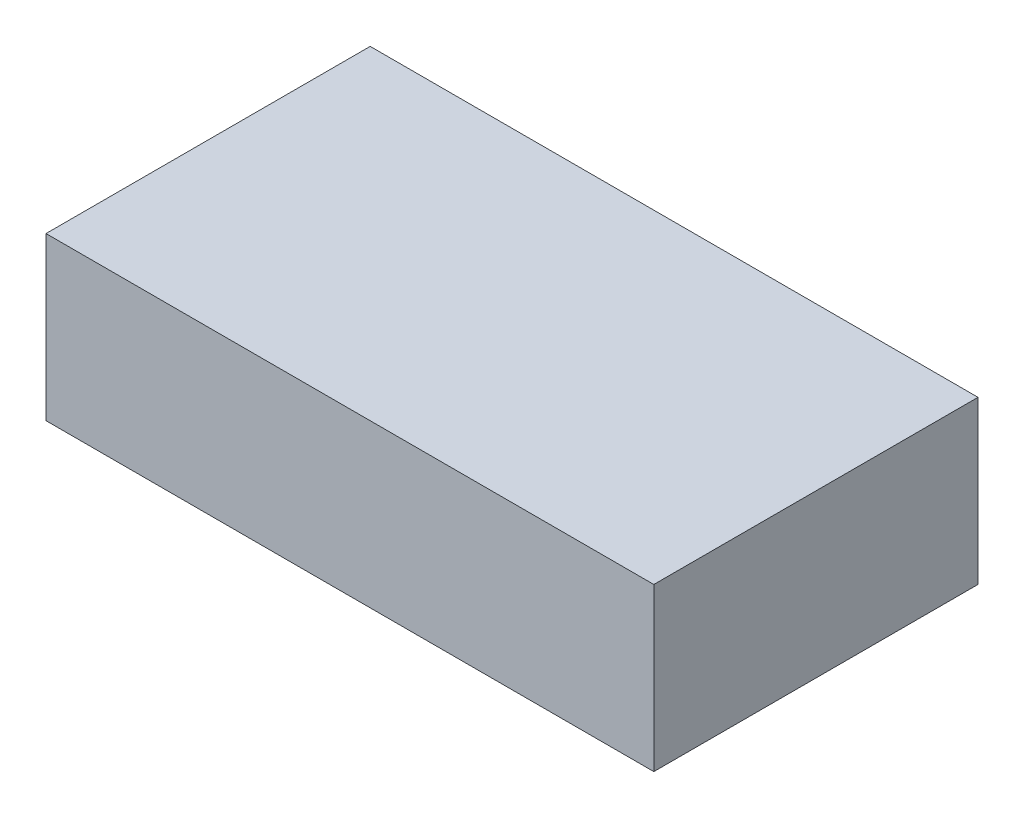
ISO-10303-21;
HEADER;
FILE_DESCRIPTION(('STEP AP214'),'2;1');
FILE_NAME('part.step','',(''),(''),'','','');
FILE_SCHEMA(('AUTOMOTIVE_DESIGN { 1 0 10303 214 1 1 1 1 }'));
ENDSEC;
DATA;
#1=APPLICATION_CONTEXT('core data for automotive mechanical design processes');
#2=APPLICATION_PROTOCOL_DEFINITION('international standard','automotive_design',2000,#1);
#3=PRODUCT_CONTEXT('',#1,'mechanical');
#4=PRODUCT('Part','Part','',(#3));
#5=PRODUCT_RELATED_PRODUCT_CATEGORY('part','',(#4));
#6=PRODUCT_DEFINITION_FORMATION('','',#4);
#7=PRODUCT_DEFINITION_CONTEXT('part definition',#1,'design');
#8=PRODUCT_DEFINITION('design','',#6,#7);
#9=PRODUCT_DEFINITION_SHAPE('','',#8);
#10=(LENGTH_UNIT() NAMED_UNIT(*) SI_UNIT(.MILLI.,.METRE.));
#11=(NAMED_UNIT(*) PLANE_ANGLE_UNIT() SI_UNIT($,.RADIAN.));
#12=(NAMED_UNIT(*) SI_UNIT($,.STERADIAN.) SOLID_ANGLE_UNIT());
#13=UNCERTAINTY_MEASURE_WITH_UNIT(LENGTH_MEASURE(1.E-05),#10,'distance_accuracy_value','');
#14=(GEOMETRIC_REPRESENTATION_CONTEXT(3) GLOBAL_UNCERTAINTY_ASSIGNED_CONTEXT((#13)) GLOBAL_UNIT_ASSIGNED_CONTEXT((#10,
#11,#12)) REPRESENTATION_CONTEXT('',''));
#15=CARTESIAN_POINT('',(0.,0.,0.));
#16=DIRECTION('',(0.,0.,1.));
#17=DIRECTION('',(1.,0.,0.));
#18=AXIS2_PLACEMENT_3D('',#15,#16,#17);
#19=CARTESIAN_POINT('',(0.,6.34999999999999,1.11022302462516E-13));
#20=DIRECTION('',(1.,0.,0.));
#21=DIRECTION('',(0.,0.,-1.));
#22=AXIS2_PLACEMENT_3D('',#19,#20,#21);
#23=PLANE('',#22);
#24=DIRECTION('',(0.,0.,1.));
#25=VECTOR('',#24,1.);
#26=CARTESIAN_POINT('',(0.,0.,0.));
#27=LINE('',#26,#25);
#28=CARTESIAN_POINT('',(0.,0.,-304.8));
#29=VERTEX_POINT('',#28);
#30=CARTESIAN_POINT('',(0.,0.,-292.1));
#31=VERTEX_POINT('',#30);
#32=EDGE_CURVE('E99',#29,#31,#27,.T.);
#33=ORIENTED_EDGE('',*,*,#32,.T.);
#34=DIRECTION('',(0.,1.,0.));
#35=VECTOR('',#34,1.);
#36=CARTESIAN_POINT('',(0.,0.,-292.1));
#37=LINE('',#36,#35);
#38=CARTESIAN_POINT('',(0.,6.34999999999999,-292.1));
#39=VERTEX_POINT('',#38);
#40=EDGE_CURVE('E48',#31,#39,#37,.T.);
#41=ORIENTED_EDGE('',*,*,#40,.T.);
#42=DIRECTION('',(0.,0.,1.));
#43=VECTOR('',#42,1.);
#44=CARTESIAN_POINT('',(0.,6.34999999999999,1.11022302462516E-13));
#45=LINE('',#44,#43);
#46=CARTESIAN_POINT('',(0.,6.35000000000006,-304.8));
#47=VERTEX_POINT('',#46);
#48=EDGE_CURVE('E101',#47,#39,#45,.T.);
#49=ORIENTED_EDGE('',*,*,#48,.F.);
#50=DIRECTION('',(0.,-1.,0.));
#51=VECTOR('',#50,1.);
#52=CARTESIAN_POINT('',(0.,6.35000000000006,-304.8));
#53=LINE('',#52,#51);
#54=EDGE_CURVE('E11',#47,#29,#53,.T.);
#55=ORIENTED_EDGE('',*,*,#54,.T.);
#56=EDGE_LOOP('',(#33,#41,#49,#55));
#57=FACE_BOUND('',#56,.T.);
#58=ADVANCED_FACE('F34',(#57),#23,.F.);
#59=CARTESIAN_POINT('',(0.,6.35000000000006,-304.8));
#60=DIRECTION('',(0.,0.,1.));
#61=DIRECTION('',(1.,0.,0.));
#62=AXIS2_PLACEMENT_3D('',#59,#60,#61);
#63=PLANE('',#62);
#64=DIRECTION('',(-1.,0.,0.));
#65=VECTOR('',#64,1.);
#66=CARTESIAN_POINT('',(0.,6.35000000000006,-304.8));
#67=LINE('',#66,#65);
#68=CARTESIAN_POINT('',(23.8125,6.35000000000006,-304.8));
#69=VERTEX_POINT('',#68);
#70=EDGE_CURVE('E41',#69,#47,#67,.T.);
#71=ORIENTED_EDGE('',*,*,#70,.F.);
#72=DIRECTION('',(0.,1.,0.));
#73=VECTOR('',#72,1.);
#74=CARTESIAN_POINT('',(23.8125,0.,-304.8));
#75=LINE('',#74,#73);
#76=CARTESIAN_POINT('',(23.8125,0.,-304.8));
#77=VERTEX_POINT('',#76);
#78=EDGE_CURVE('E97',#77,#69,#75,.T.);
#79=ORIENTED_EDGE('',*,*,#78,.F.);
#80=DIRECTION('',(-1.,0.,0.));
#81=VECTOR('',#80,1.);
#82=CARTESIAN_POINT('',(0.,0.,-304.8));
#83=LINE('',#82,#81);
#84=EDGE_CURVE('E91',#77,#29,#83,.T.);
#85=ORIENTED_EDGE('',*,*,#84,.T.);
#86=ORIENTED_EDGE('',*,*,#54,.F.);
#87=EDGE_LOOP('',(#71,#79,#85,#86));
#88=FACE_BOUND('',#87,.T.);
#89=ADVANCED_FACE('F105',(#88),#63,.F.);
#90=CARTESIAN_POINT('',(0.,6.34999999999999,1.11022302462516E-13));
#91=DIRECTION('',(0.,-1.,0.));
#92=DIRECTION('',(0.,0.,-1.));
#93=AXIS2_PLACEMENT_3D('',#90,#91,#92);
#94=PLANE('',#93);
#95=DIRECTION('',(-1.,0.,0.));
#96=VECTOR('',#95,1.);
#97=CARTESIAN_POINT('',(23.8125,6.34999999999999,-292.1));
#98=LINE('',#97,#96);
#99=CARTESIAN_POINT('',(23.8125,6.34999999999999,-292.1));
#100=VERTEX_POINT('',#99);
#101=EDGE_CURVE('E92',#100,#39,#98,.T.);
#102=ORIENTED_EDGE('',*,*,#101,.F.);
#103=DIRECTION('',(0.,0.,1.));
#104=VECTOR('',#103,1.);
#105=CARTESIAN_POINT('',(23.8125,6.35000000000006,-304.8));
#106=LINE('',#105,#104);
#107=EDGE_CURVE('E80',#69,#100,#106,.T.);
#108=ORIENTED_EDGE('',*,*,#107,.F.);
#109=ORIENTED_EDGE('',*,*,#70,.T.);
#110=ORIENTED_EDGE('',*,*,#48,.T.);
#111=EDGE_LOOP('',(#102,#108,#109,#110));
#112=FACE_BOUND('',#111,.T.);
#113=ADVANCED_FACE('F108',(#112),#94,.F.);
#114=CARTESIAN_POINT('',(0.,0.,0.));
#115=DIRECTION('',(0.,-1.,0.));
#116=DIRECTION('',(0.,0.,-1.));
#117=AXIS2_PLACEMENT_3D('',#114,#115,#116);
#118=PLANE('',#117);
#119=DIRECTION('',(0.,0.,1.));
#120=VECTOR('',#119,1.);
#121=CARTESIAN_POINT('',(23.8125,0.,-304.8));
#122=LINE('',#121,#120);
#123=CARTESIAN_POINT('',(23.8125,0.,-292.1));
#124=VERTEX_POINT('',#123);
#125=EDGE_CURVE('E78',#77,#124,#122,.T.);
#126=ORIENTED_EDGE('',*,*,#125,.T.);
#127=DIRECTION('',(-1.,0.,0.));
#128=VECTOR('',#127,1.);
#129=CARTESIAN_POINT('',(23.8125,0.,-292.1));
#130=LINE('',#129,#128);
#131=EDGE_CURVE('E82',#124,#31,#130,.T.);
#132=ORIENTED_EDGE('',*,*,#131,.T.);
#133=ORIENTED_EDGE('',*,*,#32,.F.);
#134=ORIENTED_EDGE('',*,*,#84,.F.);
#135=EDGE_LOOP('',(#126,#132,#133,#134));
#136=FACE_BOUND('',#135,.T.);
#137=ADVANCED_FACE('F90',(#136),#118,.T.);
#138=CARTESIAN_POINT('',(23.8125,0.,-304.8));
#139=DIRECTION('',(-1.,0.,0.));
#140=DIRECTION('',(0.,0.,1.));
#141=AXIS2_PLACEMENT_3D('',#138,#139,#140);
#142=PLANE('',#141);
#143=ORIENTED_EDGE('',*,*,#107,.T.);
#144=DIRECTION('',(0.,1.,0.));
#145=VECTOR('',#144,1.);
#146=CARTESIAN_POINT('',(23.8125,0.,-292.1));
#147=LINE('',#146,#145);
#148=EDGE_CURVE('E75',#124,#100,#147,.T.);
#149=ORIENTED_EDGE('',*,*,#148,.F.);
#150=ORIENTED_EDGE('',*,*,#125,.F.);
#151=ORIENTED_EDGE('',*,*,#78,.T.);
#152=EDGE_LOOP('',(#143,#149,#150,#151));
#153=FACE_BOUND('',#152,.T.);
#154=ADVANCED_FACE('F76',(#153),#142,.F.);
#155=CARTESIAN_POINT('',(23.8125,0.,-292.1));
#156=DIRECTION('',(0.,0.,-1.));
#157=DIRECTION('',(-1.,0.,0.));
#158=AXIS2_PLACEMENT_3D('',#155,#156,#157);
#159=PLANE('',#158);
#160=ORIENTED_EDGE('',*,*,#101,.T.);
#161=ORIENTED_EDGE('',*,*,#40,.F.);
#162=ORIENTED_EDGE('',*,*,#131,.F.);
#163=ORIENTED_EDGE('',*,*,#148,.T.);
#164=EDGE_LOOP('',(#160,#161,#162,#163));
#165=FACE_BOUND('',#164,.T.);
#166=ADVANCED_FACE('F84',(#165),#159,.F.);
#167=CLOSED_SHELL('',(#58,#89,#113,#137,#154,#166));
#168=MANIFOLD_SOLID_BREP('B2',#167);
#169=ADVANCED_BREP_SHAPE_REPRESENTATION('',(#18,#168),#14);
#170=SHAPE_DEFINITION_REPRESENTATION(#9,#169);
ENDSEC;
END-ISO-10303-21;
